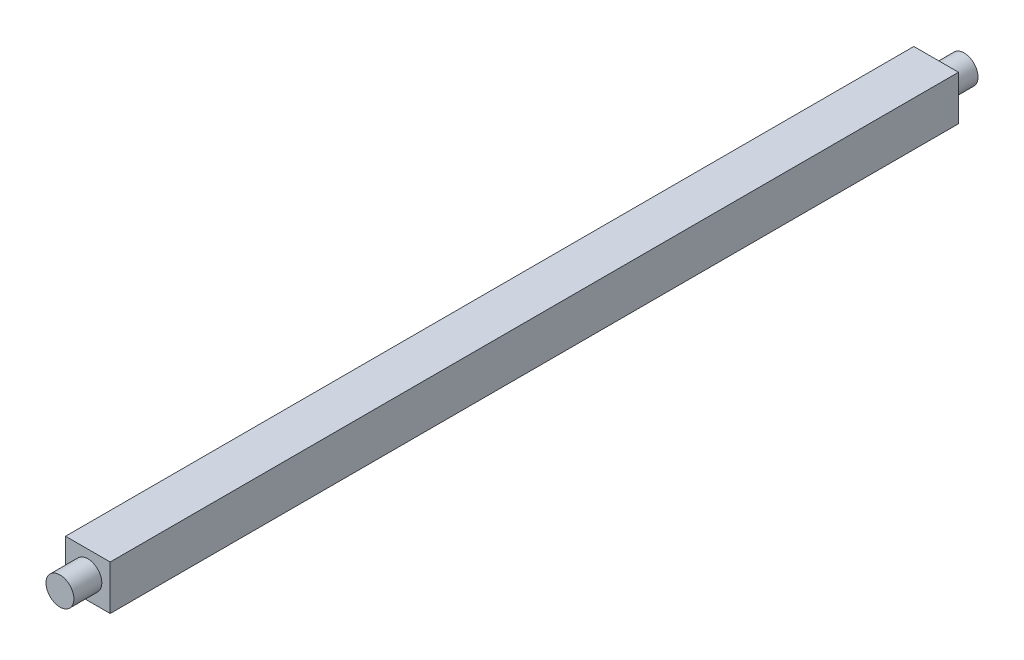
ISO-10303-21;
HEADER;
FILE_DESCRIPTION(('STEP AP214'),'2;1');
FILE_NAME('part.step','',(''),(''),'','','');
FILE_SCHEMA(('AUTOMOTIVE_DESIGN { 1 0 10303 214 1 1 1 1 }'));
ENDSEC;
DATA;
#1=APPLICATION_CONTEXT('core data for automotive mechanical design processes');
#2=APPLICATION_PROTOCOL_DEFINITION('international standard','automotive_design',2000,#1);
#3=PRODUCT_CONTEXT('',#1,'mechanical');
#4=PRODUCT('Part','Part','',(#3));
#5=PRODUCT_RELATED_PRODUCT_CATEGORY('part','',(#4));
#6=PRODUCT_DEFINITION_FORMATION('','',#4);
#7=PRODUCT_DEFINITION_CONTEXT('part definition',#1,'design');
#8=PRODUCT_DEFINITION('design','',#6,#7);
#9=PRODUCT_DEFINITION_SHAPE('','',#8);
#10=(LENGTH_UNIT() NAMED_UNIT(*) SI_UNIT(.MILLI.,.METRE.));
#11=(NAMED_UNIT(*) PLANE_ANGLE_UNIT() SI_UNIT($,.RADIAN.));
#12=(NAMED_UNIT(*) SI_UNIT($,.STERADIAN.) SOLID_ANGLE_UNIT());
#13=UNCERTAINTY_MEASURE_WITH_UNIT(LENGTH_MEASURE(1.E-05),#10,'distance_accuracy_value','');
#14=(GEOMETRIC_REPRESENTATION_CONTEXT(3) GLOBAL_UNCERTAINTY_ASSIGNED_CONTEXT((#13)) GLOBAL_UNIT_ASSIGNED_CONTEXT((#10,
#11,#12)) REPRESENTATION_CONTEXT('',''));
#15=CARTESIAN_POINT('',(0.,0.,0.));
#16=DIRECTION('',(0.,0.,1.));
#17=DIRECTION('',(1.,0.,0.));
#18=AXIS2_PLACEMENT_3D('',#15,#16,#17);
#19=CARTESIAN_POINT('',(4.,-4.,76.));
#20=DIRECTION('',(-1.,0.,0.));
#21=DIRECTION('',(0.,0.,1.));
#22=AXIS2_PLACEMENT_3D('',#19,#20,#21);
#23=PLANE('',#22);
#24=DIRECTION('',(0.,1.,0.));
#25=VECTOR('',#24,1.);
#26=CARTESIAN_POINT('',(4.,-4.,-76.));
#27=LINE('',#26,#25);
#28=CARTESIAN_POINT('',(4.,-4.,-76.));
#29=VERTEX_POINT('',#28);
#30=CARTESIAN_POINT('',(4.,4.,-76.));
#31=VERTEX_POINT('',#30);
#32=EDGE_CURVE('E99',#29,#31,#27,.T.);
#33=ORIENTED_EDGE('',*,*,#32,.T.);
#34=DIRECTION('',(0.,0.,-1.));
#35=VECTOR('',#34,1.);
#36=CARTESIAN_POINT('',(4.,4.,76.));
#37=LINE('',#36,#35);
#38=CARTESIAN_POINT('',(4.,4.,76.));
#39=VERTEX_POINT('',#38);
#40=EDGE_CURVE('E41',#39,#31,#37,.T.);
#41=ORIENTED_EDGE('',*,*,#40,.F.);
#42=DIRECTION('',(0.,1.,0.));
#43=VECTOR('',#42,1.);
#44=CARTESIAN_POINT('',(4.,-4.,76.));
#45=LINE('',#44,#43);
#46=CARTESIAN_POINT('',(4.,-4.,76.));
#47=VERTEX_POINT('',#46);
#48=EDGE_CURVE('E85',#47,#39,#45,.T.);
#49=ORIENTED_EDGE('',*,*,#48,.F.);
#50=DIRECTION('',(0.,0.,-1.));
#51=VECTOR('',#50,1.);
#52=CARTESIAN_POINT('',(4.,-4.,76.));
#53=LINE('',#52,#51);
#54=EDGE_CURVE('E95',#47,#29,#53,.T.);
#55=ORIENTED_EDGE('',*,*,#54,.T.);
#56=EDGE_LOOP('',(#33,#41,#49,#55));
#57=FACE_BOUND('',#56,.T.);
#58=ADVANCED_FACE('F33',(#57),#23,.F.);
#59=CARTESIAN_POINT('',(-4.,4.,76.));
#60=DIRECTION('',(0.,-1.,0.));
#61=DIRECTION('',(0.,0.,-1.));
#62=AXIS2_PLACEMENT_3D('',#59,#60,#61);
#63=PLANE('',#62);
#64=DIRECTION('',(-1.,0.,0.));
#65=VECTOR('',#64,1.);
#66=CARTESIAN_POINT('',(-4.,4.,-76.));
#67=LINE('',#66,#65);
#68=CARTESIAN_POINT('',(-4.,4.,-76.));
#69=VERTEX_POINT('',#68);
#70=EDGE_CURVE('E90',#31,#69,#67,.T.);
#71=ORIENTED_EDGE('',*,*,#70,.T.);
#72=DIRECTION('',(0.,0.,-1.));
#73=VECTOR('',#72,1.);
#74=CARTESIAN_POINT('',(-4.,4.,76.));
#75=LINE('',#74,#73);
#76=CARTESIAN_POINT('',(-4.,4.,76.));
#77=VERTEX_POINT('',#76);
#78=EDGE_CURVE('E88',#77,#69,#75,.T.);
#79=ORIENTED_EDGE('',*,*,#78,.F.);
#80=DIRECTION('',(-1.,0.,0.));
#81=VECTOR('',#80,1.);
#82=CARTESIAN_POINT('',(-4.,4.,76.));
#83=LINE('',#82,#81);
#84=EDGE_CURVE('E80',#39,#77,#83,.T.);
#85=ORIENTED_EDGE('',*,*,#84,.F.);
#86=ORIENTED_EDGE('',*,*,#40,.T.);
#87=EDGE_LOOP('',(#71,#79,#85,#86));
#88=FACE_BOUND('',#87,.T.);
#89=ADVANCED_FACE('F89',(#88),#63,.F.);
#90=CARTESIAN_POINT('',(-4.,-4.,76.));
#91=DIRECTION('',(1.,0.,0.));
#92=DIRECTION('',(0.,0.,-1.));
#93=AXIS2_PLACEMENT_3D('',#90,#91,#92);
#94=PLANE('',#93);
#95=DIRECTION('',(0.,-1.,0.));
#96=VECTOR('',#95,1.);
#97=CARTESIAN_POINT('',(-4.,-4.,-76.));
#98=LINE('',#97,#96);
#99=CARTESIAN_POINT('',(-4.,-4.,-76.));
#100=VERTEX_POINT('',#99);
#101=EDGE_CURVE('E66',#69,#100,#98,.T.);
#102=ORIENTED_EDGE('',*,*,#101,.T.);
#103=DIRECTION('',(0.,0.,-1.));
#104=VECTOR('',#103,1.);
#105=CARTESIAN_POINT('',(-4.,-4.,76.));
#106=LINE('',#105,#104);
#107=CARTESIAN_POINT('',(-4.,-4.,76.));
#108=VERTEX_POINT('',#107);
#109=EDGE_CURVE('E91',#108,#100,#106,.T.);
#110=ORIENTED_EDGE('',*,*,#109,.F.);
#111=DIRECTION('',(0.,-1.,0.));
#112=VECTOR('',#111,1.);
#113=CARTESIAN_POINT('',(-4.,-4.,76.));
#114=LINE('',#113,#112);
#115=EDGE_CURVE('E83',#77,#108,#114,.T.);
#116=ORIENTED_EDGE('',*,*,#115,.F.);
#117=ORIENTED_EDGE('',*,*,#78,.T.);
#118=EDGE_LOOP('',(#102,#110,#116,#117));
#119=FACE_BOUND('',#118,.T.);
#120=ADVANCED_FACE('F93',(#119),#94,.F.);
#121=CARTESIAN_POINT('',(-4.,-4.,76.));
#122=DIRECTION('',(0.,1.,0.));
#123=DIRECTION('',(0.,0.,1.));
#124=AXIS2_PLACEMENT_3D('',#121,#122,#123);
#125=PLANE('',#124);
#126=DIRECTION('',(1.,0.,0.));
#127=VECTOR('',#126,1.);
#128=CARTESIAN_POINT('',(-4.,-4.,-76.));
#129=LINE('',#128,#127);
#130=EDGE_CURVE('E72',#100,#29,#129,.T.);
#131=ORIENTED_EDGE('',*,*,#130,.T.);
#132=ORIENTED_EDGE('',*,*,#54,.F.);
#133=DIRECTION('',(1.,0.,0.));
#134=VECTOR('',#133,1.);
#135=CARTESIAN_POINT('',(-4.,-4.,76.));
#136=LINE('',#135,#134);
#137=EDGE_CURVE('E49',#108,#47,#136,.T.);
#138=ORIENTED_EDGE('',*,*,#137,.F.);
#139=ORIENTED_EDGE('',*,*,#109,.T.);
#140=EDGE_LOOP('',(#131,#132,#138,#139));
#141=FACE_BOUND('',#140,.T.);
#142=ADVANCED_FACE('F122',(#141),#125,.F.);
#143=CARTESIAN_POINT('',(0.,0.,76.));
#144=DIRECTION('',(0.,0.,-1.));
#145=DIRECTION('',(-1.,0.,0.));
#146=AXIS2_PLACEMENT_3D('',#143,#144,#145);
#147=PLANE('',#146);
#148=CARTESIAN_POINT('',(0.,0.,76.));
#149=DIRECTION('',(0.,0.,-1.));
#150=DIRECTION('',(-1.,0.,0.));
#151=AXIS2_PLACEMENT_3D('',#148,#149,#150);
#152=CIRCLE('',#151,2.5);
#153=CARTESIAN_POINT('',(-2.5,0.,76.));
#154=VERTEX_POINT('',#153);
#155=EDGE_CURVE('E11',#154,#154,#152,.F.);
#156=ORIENTED_EDGE('',*,*,#155,.F.);
#157=EDGE_LOOP('',(#156));
#158=FACE_BOUND('',#157,.T.);
#159=ORIENTED_EDGE('',*,*,#48,.T.);
#160=ORIENTED_EDGE('',*,*,#84,.T.);
#161=ORIENTED_EDGE('',*,*,#115,.T.);
#162=ORIENTED_EDGE('',*,*,#137,.T.);
#163=EDGE_LOOP('',(#159,#160,#161,#162));
#164=FACE_BOUND('',#163,.T.);
#165=ADVANCED_FACE('F81',(#158,#164),#147,.F.);
#166=CARTESIAN_POINT('',(0.,0.,-76.));
#167=DIRECTION('',(0.,0.,-1.));
#168=DIRECTION('',(-1.,0.,0.));
#169=AXIS2_PLACEMENT_3D('',#166,#167,#168);
#170=PLANE('',#169);
#171=CARTESIAN_POINT('',(0.,0.,-76.));
#172=DIRECTION('',(0.,0.,-1.));
#173=DIRECTION('',(-1.,0.,0.));
#174=AXIS2_PLACEMENT_3D('',#171,#172,#173);
#175=CIRCLE('',#174,2.5);
#176=CARTESIAN_POINT('',(-2.5,0.,-76.));
#177=VERTEX_POINT('',#176);
#178=EDGE_CURVE('E190',#177,#177,#175,.T.);
#179=ORIENTED_EDGE('',*,*,#178,.F.);
#180=EDGE_LOOP('',(#179));
#181=FACE_BOUND('',#180,.T.);
#182=ORIENTED_EDGE('',*,*,#32,.F.);
#183=ORIENTED_EDGE('',*,*,#130,.F.);
#184=ORIENTED_EDGE('',*,*,#101,.F.);
#185=ORIENTED_EDGE('',*,*,#70,.F.);
#186=EDGE_LOOP('',(#182,#183,#184,#185));
#187=FACE_BOUND('',#186,.T.);
#188=ADVANCED_FACE('F110',(#181,#187),#170,.T.);
#189=CARTESIAN_POINT('',(0.,0.,81.));
#190=DIRECTION('',(0.,0.,-1.));
#191=DIRECTION('',(-1.,0.,0.));
#192=AXIS2_PLACEMENT_3D('',#189,#190,#191);
#193=CYLINDRICAL_SURFACE('',#192,2.5);
#194=CARTESIAN_POINT('',(0.,0.,81.));
#195=DIRECTION('',(0.,0.,1.));
#196=DIRECTION('',(1.,0.,0.));
#197=AXIS2_PLACEMENT_3D('',#194,#195,#196);
#198=CIRCLE('',#197,2.5);
#199=CARTESIAN_POINT('',(2.5,0.,81.));
#200=VERTEX_POINT('',#199);
#201=EDGE_CURVE('E102',#200,#200,#198,.T.);
#202=ORIENTED_EDGE('',*,*,#201,.F.);
#203=EDGE_LOOP('',(#202));
#204=FACE_BOUND('',#203,.T.);
#205=ORIENTED_EDGE('',*,*,#155,.T.);
#206=EDGE_LOOP('',(#205));
#207=FACE_BOUND('',#206,.T.);
#208=ADVANCED_FACE('F112',(#204,#207),#193,.T.);
#209=CARTESIAN_POINT('',(0.,0.,81.));
#210=DIRECTION('',(0.,0.,1.));
#211=DIRECTION('',(1.,0.,0.));
#212=AXIS2_PLACEMENT_3D('',#209,#210,#211);
#213=PLANE('',#212);
#214=ORIENTED_EDGE('',*,*,#201,.T.);
#215=EDGE_LOOP('',(#214));
#216=FACE_BOUND('',#215,.T.);
#217=ADVANCED_FACE('F119',(#216),#213,.T.);
#218=CARTESIAN_POINT('',(0.,0.,-81.));
#219=DIRECTION('',(0.,0.,1.));
#220=DIRECTION('',(1.,0.,0.));
#221=AXIS2_PLACEMENT_3D('',#218,#219,#220);
#222=CYLINDRICAL_SURFACE('',#221,2.5);
#223=CARTESIAN_POINT('',(0.,0.,-81.));
#224=DIRECTION('',(0.,0.,-1.));
#225=DIRECTION('',(-1.,0.,0.));
#226=AXIS2_PLACEMENT_3D('',#223,#224,#225);
#227=CIRCLE('',#226,2.5);
#228=CARTESIAN_POINT('',(-2.5,0.,-81.));
#229=VERTEX_POINT('',#228);
#230=EDGE_CURVE('E189',#229,#229,#227,.T.);
#231=ORIENTED_EDGE('',*,*,#230,.F.);
#232=EDGE_LOOP('',(#231));
#233=FACE_BOUND('',#232,.T.);
#234=ORIENTED_EDGE('',*,*,#178,.T.);
#235=EDGE_LOOP('',(#234));
#236=FACE_BOUND('',#235,.T.);
#237=ADVANCED_FACE('F159',(#233,#236),#222,.T.);
#238=CARTESIAN_POINT('',(0.,0.,-81.));
#239=DIRECTION('',(0.,0.,-1.));
#240=DIRECTION('',(-1.,0.,0.));
#241=AXIS2_PLACEMENT_3D('',#238,#239,#240);
#242=PLANE('',#241);
#243=ORIENTED_EDGE('',*,*,#230,.T.);
#244=EDGE_LOOP('',(#243));
#245=FACE_BOUND('',#244,.T.);
#246=ADVANCED_FACE('F173',(#245),#242,.T.);
#247=CLOSED_SHELL('',(#58,#89,#120,#142,#165,#188,#208,#217,#237,#246));
#248=MANIFOLD_SOLID_BREP('B2',#247);
#249=ADVANCED_BREP_SHAPE_REPRESENTATION('',(#18,#248),#14);
#250=SHAPE_DEFINITION_REPRESENTATION(#9,#249);
ENDSEC;
END-ISO-10303-21;
